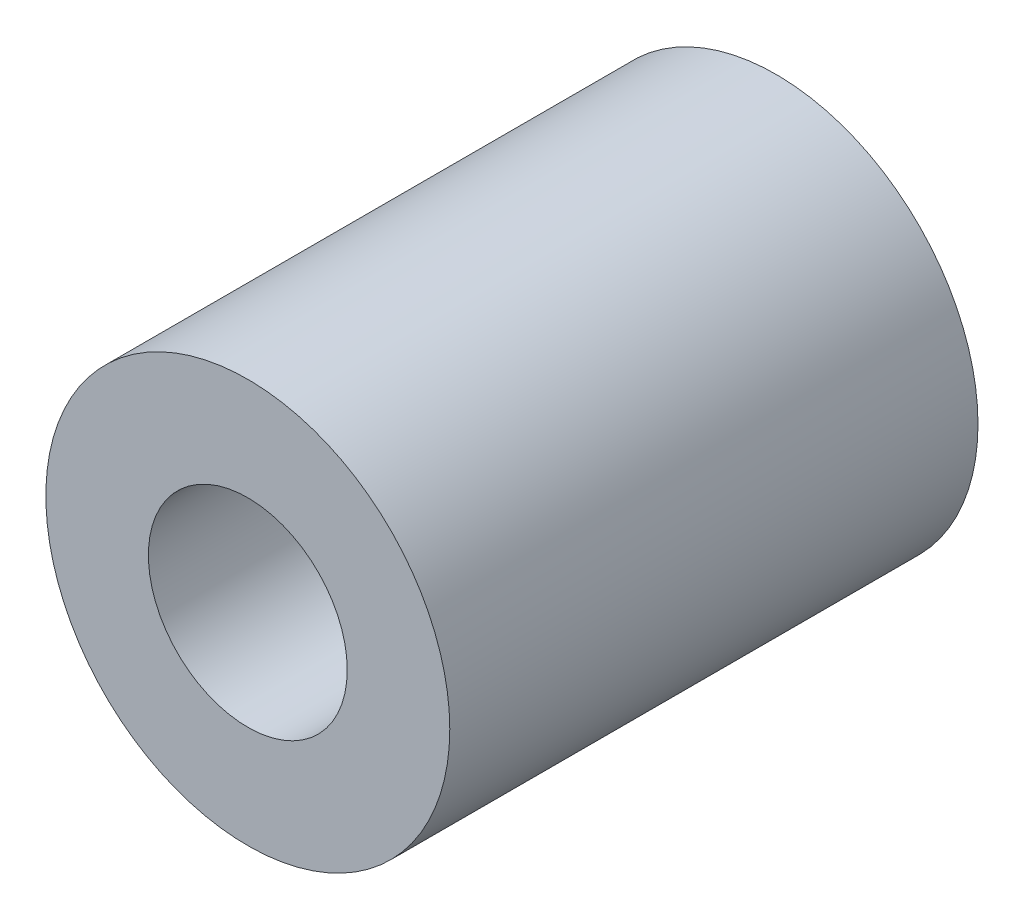
ISO-10303-21;
HEADER;
FILE_DESCRIPTION(('STEP AP214'),'2;1');
FILE_NAME('part.step','',(''),(''),'','','');
FILE_SCHEMA(('AUTOMOTIVE_DESIGN { 1 0 10303 214 1 1 1 1 }'));
ENDSEC;
DATA;
#1=APPLICATION_CONTEXT('core data for automotive mechanical design processes');
#2=APPLICATION_PROTOCOL_DEFINITION('international standard','automotive_design',2000,#1);
#3=PRODUCT_CONTEXT('',#1,'mechanical');
#4=PRODUCT('Part','Part','',(#3));
#5=PRODUCT_RELATED_PRODUCT_CATEGORY('part','',(#4));
#6=PRODUCT_DEFINITION_FORMATION('','',#4);
#7=PRODUCT_DEFINITION_CONTEXT('part definition',#1,'design');
#8=PRODUCT_DEFINITION('design','',#6,#7);
#9=PRODUCT_DEFINITION_SHAPE('','',#8);
#10=(LENGTH_UNIT() NAMED_UNIT(*) SI_UNIT(.MILLI.,.METRE.));
#11=(NAMED_UNIT(*) PLANE_ANGLE_UNIT() SI_UNIT($,.RADIAN.));
#12=(NAMED_UNIT(*) SI_UNIT($,.STERADIAN.) SOLID_ANGLE_UNIT());
#13=UNCERTAINTY_MEASURE_WITH_UNIT(LENGTH_MEASURE(1.E-05),#10,'distance_accuracy_value','');
#14=(GEOMETRIC_REPRESENTATION_CONTEXT(3) GLOBAL_UNCERTAINTY_ASSIGNED_CONTEXT((#13)) GLOBAL_UNIT_ASSIGNED_CONTEXT((#10,
#11,#12)) REPRESENTATION_CONTEXT('',''));
#15=CARTESIAN_POINT('',(0.,0.,0.));
#16=DIRECTION('',(0.,0.,1.));
#17=DIRECTION('',(1.,0.,0.));
#18=AXIS2_PLACEMENT_3D('',#15,#16,#17);
#19=CARTESIAN_POINT('',(0.,0.,8.5));
#20=DIRECTION('',(0.,0.,-1.));
#21=DIRECTION('',(-1.,0.,0.));
#22=AXIS2_PLACEMENT_3D('',#19,#20,#21);
#23=CYLINDRICAL_SURFACE('',#22,3.25);
#24=CARTESIAN_POINT('',(0.,0.,8.5));
#25=DIRECTION('',(0.,0.,1.));
#26=DIRECTION('',(1.,0.,0.));
#27=AXIS2_PLACEMENT_3D('',#24,#25,#26);
#28=CIRCLE('',#27,3.25);
#29=CARTESIAN_POINT('',(3.25,0.,8.5));
#30=VERTEX_POINT('',#29);
#31=EDGE_CURVE('E10',#30,#30,#28,.T.);
#32=ORIENTED_EDGE('',*,*,#31,.F.);
#33=EDGE_LOOP('',(#32));
#34=FACE_BOUND('',#33,.T.);
#35=CARTESIAN_POINT('',(0.,0.,0.));
#36=DIRECTION('',(0.,0.,1.));
#37=DIRECTION('',(1.,0.,0.));
#38=AXIS2_PLACEMENT_3D('',#35,#36,#37);
#39=CIRCLE('',#38,3.25);
#40=CARTESIAN_POINT('',(3.25,0.,0.));
#41=VERTEX_POINT('',#40);
#42=EDGE_CURVE('E38',#41,#41,#39,.T.);
#43=ORIENTED_EDGE('',*,*,#42,.T.);
#44=EDGE_LOOP('',(#43));
#45=FACE_BOUND('',#44,.T.);
#46=ADVANCED_FACE('F31',(#34,#45),#23,.T.);
#47=CARTESIAN_POINT('',(0.,0.,8.5));
#48=DIRECTION('',(0.,0.,1.));
#49=DIRECTION('',(1.,0.,0.));
#50=AXIS2_PLACEMENT_3D('',#47,#48,#49);
#51=PLANE('',#50);
#52=CARTESIAN_POINT('',(0.,0.,8.5));
#53=DIRECTION('',(0.,0.,1.));
#54=DIRECTION('',(1.,0.,0.));
#55=AXIS2_PLACEMENT_3D('',#52,#53,#54);
#56=CIRCLE('',#55,1.6);
#57=CARTESIAN_POINT('',(1.6,0.,8.5));
#58=VERTEX_POINT('',#57);
#59=EDGE_CURVE('E44',#58,#58,#56,.T.);
#60=ORIENTED_EDGE('',*,*,#59,.F.);
#61=EDGE_LOOP('',(#60));
#62=FACE_BOUND('',#61,.T.);
#63=ORIENTED_EDGE('',*,*,#31,.T.);
#64=EDGE_LOOP('',(#63));
#65=FACE_BOUND('',#64,.T.);
#66=ADVANCED_FACE('F60',(#62,#65),#51,.T.);
#67=CARTESIAN_POINT('',(0.,0.,0.));
#68=DIRECTION('',(0.,0.,1.));
#69=DIRECTION('',(1.,0.,0.));
#70=AXIS2_PLACEMENT_3D('',#67,#68,#69);
#71=PLANE('',#70);
#72=CARTESIAN_POINT('',(0.,0.,0.));
#73=DIRECTION('',(0.,0.,1.));
#74=DIRECTION('',(1.,0.,0.));
#75=AXIS2_PLACEMENT_3D('',#72,#73,#74);
#76=CIRCLE('',#75,1.6);
#77=CARTESIAN_POINT('',(1.6,0.,0.));
#78=VERTEX_POINT('',#77);
#79=EDGE_CURVE('E34',#78,#78,#76,.T.);
#80=ORIENTED_EDGE('',*,*,#79,.T.);
#81=EDGE_LOOP('',(#80));
#82=FACE_BOUND('',#81,.T.);
#83=ORIENTED_EDGE('',*,*,#42,.F.);
#84=EDGE_LOOP('',(#83));
#85=FACE_BOUND('',#84,.T.);
#86=ADVANCED_FACE('F51',(#82,#85),#71,.F.);
#87=CARTESIAN_POINT('',(0.,0.,-0.499999999999999));
#88=DIRECTION('',(0.,0.,1.));
#89=DIRECTION('',(1.,0.,0.));
#90=AXIS2_PLACEMENT_3D('',#87,#88,#89);
#91=CYLINDRICAL_SURFACE('',#90,1.6);
#92=ORIENTED_EDGE('',*,*,#59,.T.);
#93=EDGE_LOOP('',(#92));
#94=FACE_BOUND('',#93,.T.);
#95=ORIENTED_EDGE('',*,*,#79,.F.);
#96=EDGE_LOOP('',(#95));
#97=FACE_BOUND('',#96,.T.);
#98=ADVANCED_FACE('F54',(#94,#97),#91,.F.);
#99=CLOSED_SHELL('',(#46,#66,#86,#98));
#100=MANIFOLD_SOLID_BREP('B2',#99);
#101=ADVANCED_BREP_SHAPE_REPRESENTATION('',(#18,#100),#14);
#102=SHAPE_DEFINITION_REPRESENTATION(#9,#101);
ENDSEC;
END-ISO-10303-21;
